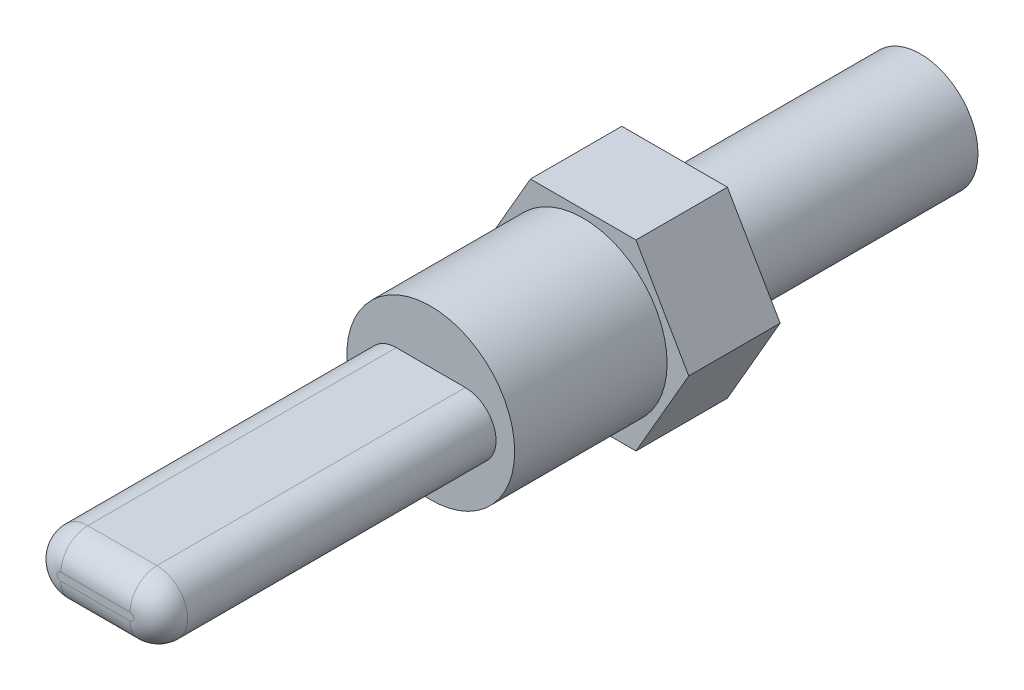
ISO-10303-21;
HEADER;
FILE_DESCRIPTION(('STEP AP214'),'2;1');
FILE_NAME('part.step','',(''),(''),'','','');
FILE_SCHEMA(('AUTOMOTIVE_DESIGN { 1 0 10303 214 1 1 1 1 }'));
ENDSEC;
DATA;
#1=APPLICATION_CONTEXT('core data for automotive mechanical design processes');
#2=APPLICATION_PROTOCOL_DEFINITION('international standard','automotive_design',2000,#1);
#3=PRODUCT_CONTEXT('',#1,'mechanical');
#4=PRODUCT('Part','Part','',(#3));
#5=PRODUCT_RELATED_PRODUCT_CATEGORY('part','',(#4));
#6=PRODUCT_DEFINITION_FORMATION('','',#4);
#7=PRODUCT_DEFINITION_CONTEXT('part definition',#1,'design');
#8=PRODUCT_DEFINITION('design','',#6,#7);
#9=PRODUCT_DEFINITION_SHAPE('','',#8);
#10=(LENGTH_UNIT() NAMED_UNIT(*) SI_UNIT(.MILLI.,.METRE.));
#11=(NAMED_UNIT(*) PLANE_ANGLE_UNIT() SI_UNIT($,.RADIAN.));
#12=(NAMED_UNIT(*) SI_UNIT($,.STERADIAN.) SOLID_ANGLE_UNIT());
#13=UNCERTAINTY_MEASURE_WITH_UNIT(LENGTH_MEASURE(1.E-05),#10,'distance_accuracy_value','');
#14=(GEOMETRIC_REPRESENTATION_CONTEXT(3) GLOBAL_UNCERTAINTY_ASSIGNED_CONTEXT((#13)) GLOBAL_UNIT_ASSIGNED_CONTEXT((#10,
#11,#12)) REPRESENTATION_CONTEXT('',''));
#15=CARTESIAN_POINT('',(0.,0.,0.));
#16=DIRECTION('',(0.,0.,1.));
#17=DIRECTION('',(1.,0.,0.));
#18=AXIS2_PLACEMENT_3D('',#15,#16,#17);
#19=CARTESIAN_POINT('',(0.,0.,12.75));
#20=DIRECTION('',(0.,0.,1.));
#21=DIRECTION('',(1.,0.,0.));
#22=AXIS2_PLACEMENT_3D('',#19,#20,#21);
#23=PLANE('',#22);
#24=CARTESIAN_POINT('',(0.,0.,12.75));
#25=DIRECTION('',(0.,0.,1.));
#26=DIRECTION('',(1.,0.,0.));
#27=AXIS2_PLACEMENT_3D('',#24,#25,#26);
#28=CIRCLE('',#27,2.185);
#29=CARTESIAN_POINT('',(2.185,0.,12.75));
#30=VERTEX_POINT('',#29);
#31=EDGE_CURVE('E152',#30,#30,#28,.T.);
#32=ORIENTED_EDGE('',*,*,#31,.T.);
#33=EDGE_LOOP('',(#32));
#34=FACE_BOUND('',#33,.T.);
#35=DIRECTION('',(1.,0.,0.));
#36=VECTOR('',#35,1.);
#37=CARTESIAN_POINT('',(-0.9,-0.8,12.75));
#38=LINE('',#37,#36);
#39=CARTESIAN_POINT('',(-0.9,-0.8,12.75));
#40=VERTEX_POINT('',#39);
#41=CARTESIAN_POINT('',(0.9,-0.8,12.75));
#42=VERTEX_POINT('',#41);
#43=EDGE_CURVE('E125',#40,#42,#38,.T.);
#44=ORIENTED_EDGE('',*,*,#43,.F.);
#45=CARTESIAN_POINT('',(-0.9,0.,12.75));
#46=DIRECTION('',(0.,0.,1.));
#47=DIRECTION('',(1.,0.,0.));
#48=AXIS2_PLACEMENT_3D('',#45,#46,#47);
#49=CIRCLE('',#48,0.8);
#50=CARTESIAN_POINT('',(-0.9,0.8,12.75));
#51=VERTEX_POINT('',#50);
#52=EDGE_CURVE('E133',#51,#40,#49,.T.);
#53=ORIENTED_EDGE('',*,*,#52,.F.);
#54=DIRECTION('',(-1.,0.,0.));
#55=VECTOR('',#54,1.);
#56=CARTESIAN_POINT('',(-0.9,0.8,12.75));
#57=LINE('',#56,#55);
#58=CARTESIAN_POINT('',(0.9,0.8,12.75));
#59=VERTEX_POINT('',#58);
#60=EDGE_CURVE('E144',#59,#51,#57,.T.);
#61=ORIENTED_EDGE('',*,*,#60,.F.);
#62=CARTESIAN_POINT('',(0.9,0.,12.75));
#63=DIRECTION('',(0.,0.,1.));
#64=DIRECTION('',(1.,0.,0.));
#65=AXIS2_PLACEMENT_3D('',#62,#63,#64);
#66=CIRCLE('',#65,0.8);
#67=EDGE_CURVE('E142',#42,#59,#66,.T.);
#68=ORIENTED_EDGE('',*,*,#67,.F.);
#69=EDGE_LOOP('',(#44,#53,#61,#68));
#70=FACE_BOUND('',#69,.T.);
#71=ADVANCED_FACE('F33',(#34,#70),#23,.T.);
#72=CARTESIAN_POINT('',(0.,0.,6.4));
#73=DIRECTION('',(0.,0.,-1.));
#74=DIRECTION('',(-1.,0.,0.));
#75=AXIS2_PLACEMENT_3D('',#72,#73,#74);
#76=CYLINDRICAL_SURFACE('',#75,1.5);
#77=CARTESIAN_POINT('',(0.,0.,6.4));
#78=DIRECTION('',(0.,0.,1.));
#79=DIRECTION('',(1.,0.,0.));
#80=AXIS2_PLACEMENT_3D('',#77,#78,#79);
#81=CIRCLE('',#80,1.5);
#82=CARTESIAN_POINT('',(1.5,0.,6.4));
#83=VERTEX_POINT('',#82);
#84=EDGE_CURVE('E202',#83,#83,#81,.T.);
#85=ORIENTED_EDGE('',*,*,#84,.F.);
#86=EDGE_LOOP('',(#85));
#87=FACE_BOUND('',#86,.T.);
#88=CARTESIAN_POINT('',(0.,0.,0.));
#89=DIRECTION('',(0.,0.,1.));
#90=DIRECTION('',(1.,0.,0.));
#91=AXIS2_PLACEMENT_3D('',#88,#89,#90);
#92=CIRCLE('',#91,1.5);
#93=CARTESIAN_POINT('',(1.5,0.,0.));
#94=VERTEX_POINT('',#93);
#95=EDGE_CURVE('E201',#94,#94,#92,.T.);
#96=ORIENTED_EDGE('',*,*,#95,.T.);
#97=EDGE_LOOP('',(#96));
#98=FACE_BOUND('',#97,.T.);
#99=ADVANCED_FACE('F256',(#87,#98),#76,.T.);
#100=CARTESIAN_POINT('',(0.,0.,0.));
#101=DIRECTION('',(0.,0.,1.));
#102=DIRECTION('',(1.,0.,0.));
#103=AXIS2_PLACEMENT_3D('',#100,#101,#102);
#104=PLANE('',#103);
#105=ORIENTED_EDGE('',*,*,#95,.F.);
#106=EDGE_LOOP('',(#105));
#107=FACE_BOUND('',#106,.T.);
#108=ADVANCED_FACE('F262',(#107),#104,.F.);
#109=CARTESIAN_POINT('',(-1.37409364067129,-2.38000000000001,8.78));
#110=DIRECTION('',(0.,1.,0.));
#111=DIRECTION('',(-1.,0.,0.));
#112=AXIS2_PLACEMENT_3D('',#109,#110,#111);
#113=PLANE('',#112);
#114=DIRECTION('',(1.,0.,0.));
#115=VECTOR('',#114,1.);
#116=CARTESIAN_POINT('',(-1.37409364067129,-2.38000000000001,6.4));
#117=LINE('',#116,#115);
#118=CARTESIAN_POINT('',(-1.37409364067129,-2.38000000000001,6.4));
#119=VERTEX_POINT('',#118);
#120=CARTESIAN_POINT('',(1.37409364067133,-2.37999999999999,6.4));
#121=VERTEX_POINT('',#120);
#122=EDGE_CURVE('E155',#119,#121,#117,.T.);
#123=ORIENTED_EDGE('',*,*,#122,.T.);
#124=DIRECTION('',(0.,0.,-1.));
#125=VECTOR('',#124,1.);
#126=CARTESIAN_POINT('',(1.37409364067133,-2.37999999999999,8.78));
#127=LINE('',#126,#125);
#128=CARTESIAN_POINT('',(1.37409364067133,-2.37999999999999,8.78));
#129=VERTEX_POINT('',#128);
#130=EDGE_CURVE('E198',#129,#121,#127,.T.);
#131=ORIENTED_EDGE('',*,*,#130,.F.);
#132=DIRECTION('',(1.,0.,0.));
#133=VECTOR('',#132,1.);
#134=CARTESIAN_POINT('',(-1.37409364067129,-2.38000000000001,8.78));
#135=LINE('',#134,#133);
#136=CARTESIAN_POINT('',(-1.37409364067129,-2.38000000000001,8.78));
#137=VERTEX_POINT('',#136);
#138=EDGE_CURVE('E158',#137,#129,#135,.T.);
#139=ORIENTED_EDGE('',*,*,#138,.F.);
#140=DIRECTION('',(0.,0.,-1.));
#141=VECTOR('',#140,1.);
#142=CARTESIAN_POINT('',(-1.37409364067129,-2.38000000000001,8.78));
#143=LINE('',#142,#141);
#144=EDGE_CURVE('E172',#137,#119,#143,.T.);
#145=ORIENTED_EDGE('',*,*,#144,.T.);
#146=EDGE_LOOP('',(#123,#131,#139,#145));
#147=FACE_BOUND('',#146,.T.);
#148=ADVANCED_FACE('F299',(#147),#113,.F.);
#149=CARTESIAN_POINT('',(1.37409364067133,-2.37999999999999,8.78));
#150=DIRECTION('',(-0.866025403784442,0.499999999999994,0.));
#151=DIRECTION('',(-0.499999999999994,-0.866025403784442,0.));
#152=AXIS2_PLACEMENT_3D('',#149,#150,#151);
#153=PLANE('',#152);
#154=DIRECTION('',(0.499999999999994,0.866025403784442,0.));
#155=VECTOR('',#154,1.);
#156=CARTESIAN_POINT('',(1.37409364067133,-2.37999999999999,6.4));
#157=LINE('',#156,#155);
#158=CARTESIAN_POINT('',(2.74818728134262,0.,6.4));
#159=VERTEX_POINT('',#158);
#160=EDGE_CURVE('E175',#121,#159,#157,.T.);
#161=ORIENTED_EDGE('',*,*,#160,.T.);
#162=DIRECTION('',(0.,0.,-1.));
#163=VECTOR('',#162,1.);
#164=CARTESIAN_POINT('',(2.74818728134262,0.,8.78));
#165=LINE('',#164,#163);
#166=CARTESIAN_POINT('',(2.74818728134262,0.,8.78));
#167=VERTEX_POINT('',#166);
#168=EDGE_CURVE('E195',#167,#159,#165,.T.);
#169=ORIENTED_EDGE('',*,*,#168,.F.);
#170=DIRECTION('',(0.499999999999994,0.866025403784442,0.));
#171=VECTOR('',#170,1.);
#172=CARTESIAN_POINT('',(1.37409364067133,-2.37999999999999,8.78));
#173=LINE('',#172,#171);
#174=EDGE_CURVE('E161',#129,#167,#173,.T.);
#175=ORIENTED_EDGE('',*,*,#174,.F.);
#176=ORIENTED_EDGE('',*,*,#130,.T.);
#177=EDGE_LOOP('',(#161,#169,#175,#176));
#178=FACE_BOUND('',#177,.T.);
#179=ADVANCED_FACE('F295',(#178),#153,.F.);
#180=CARTESIAN_POINT('',(2.74818728134262,0.,8.78));
#181=DIRECTION('',(-0.866025403784435,-0.500000000000006,0.));
#182=DIRECTION('',(0.500000000000006,-0.866025403784435,0.));
#183=AXIS2_PLACEMENT_3D('',#180,#181,#182);
#184=PLANE('',#183);
#185=DIRECTION('',(-0.500000000000006,0.866025403784435,0.));
#186=VECTOR('',#185,1.);
#187=CARTESIAN_POINT('',(2.74818728134262,0.,6.4));
#188=LINE('',#187,#186);
#189=CARTESIAN_POINT('',(1.37409364067129,2.38000000000001,6.4));
#190=VERTEX_POINT('',#189);
#191=EDGE_CURVE('E177',#159,#190,#188,.T.);
#192=ORIENTED_EDGE('',*,*,#191,.T.);
#193=DIRECTION('',(0.,0.,-1.));
#194=VECTOR('',#193,1.);
#195=CARTESIAN_POINT('',(1.37409364067129,2.38000000000001,8.78));
#196=LINE('',#195,#194);
#197=CARTESIAN_POINT('',(1.37409364067129,2.38000000000001,8.78));
#198=VERTEX_POINT('',#197);
#199=EDGE_CURVE('E192',#198,#190,#196,.T.);
#200=ORIENTED_EDGE('',*,*,#199,.F.);
#201=DIRECTION('',(-0.500000000000006,0.866025403784435,0.));
#202=VECTOR('',#201,1.);
#203=CARTESIAN_POINT('',(2.74818728134262,0.,8.78));
#204=LINE('',#203,#202);
#205=EDGE_CURVE('E164',#167,#198,#204,.T.);
#206=ORIENTED_EDGE('',*,*,#205,.F.);
#207=ORIENTED_EDGE('',*,*,#168,.T.);
#208=EDGE_LOOP('',(#192,#200,#206,#207));
#209=FACE_BOUND('',#208,.T.);
#210=ADVANCED_FACE('F291',(#209),#184,.F.);
#211=CARTESIAN_POINT('',(1.37409364067129,2.38000000000001,8.78));
#212=DIRECTION('',(0.,-1.,0.));
#213=DIRECTION('',(1.,0.,0.));
#214=AXIS2_PLACEMENT_3D('',#211,#212,#213);
#215=PLANE('',#214);
#216=DIRECTION('',(-1.,0.,0.));
#217=VECTOR('',#216,1.);
#218=CARTESIAN_POINT('',(1.37409364067129,2.38000000000001,6.4));
#219=LINE('',#218,#217);
#220=CARTESIAN_POINT('',(-1.37409364067133,2.37999999999999,6.4));
#221=VERTEX_POINT('',#220);
#222=EDGE_CURVE('E179',#190,#221,#219,.T.);
#223=ORIENTED_EDGE('',*,*,#222,.T.);
#224=DIRECTION('',(0.,0.,-1.));
#225=VECTOR('',#224,1.);
#226=CARTESIAN_POINT('',(-1.37409364067133,2.37999999999999,8.78));
#227=LINE('',#226,#225);
#228=CARTESIAN_POINT('',(-1.37409364067133,2.37999999999999,8.78));
#229=VERTEX_POINT('',#228);
#230=EDGE_CURVE('E189',#229,#221,#227,.T.);
#231=ORIENTED_EDGE('',*,*,#230,.F.);
#232=DIRECTION('',(-1.,0.,0.));
#233=VECTOR('',#232,1.);
#234=CARTESIAN_POINT('',(1.37409364067129,2.38000000000001,8.78));
#235=LINE('',#234,#233);
#236=EDGE_CURVE('E166',#198,#229,#235,.T.);
#237=ORIENTED_EDGE('',*,*,#236,.F.);
#238=ORIENTED_EDGE('',*,*,#199,.T.);
#239=EDGE_LOOP('',(#223,#231,#237,#238));
#240=FACE_BOUND('',#239,.T.);
#241=ADVANCED_FACE('F287',(#240),#215,.F.);
#242=CARTESIAN_POINT('',(-1.37409364067133,2.37999999999999,8.78));
#243=DIRECTION('',(0.866025403784442,-0.499999999999994,0.));
#244=DIRECTION('',(0.499999999999994,0.866025403784442,0.));
#245=AXIS2_PLACEMENT_3D('',#242,#243,#244);
#246=PLANE('',#245);
#247=DIRECTION('',(-0.499999999999994,-0.866025403784442,0.));
#248=VECTOR('',#247,1.);
#249=CARTESIAN_POINT('',(-1.37409364067133,2.37999999999999,6.4));
#250=LINE('',#249,#248);
#251=CARTESIAN_POINT('',(-2.74818728134262,0.,6.4));
#252=VERTEX_POINT('',#251);
#253=EDGE_CURVE('E181',#221,#252,#250,.T.);
#254=ORIENTED_EDGE('',*,*,#253,.T.);
#255=DIRECTION('',(0.,0.,-1.));
#256=VECTOR('',#255,1.);
#257=CARTESIAN_POINT('',(-2.74818728134262,0.,8.78));
#258=LINE('',#257,#256);
#259=CARTESIAN_POINT('',(-2.74818728134262,0.,8.78));
#260=VERTEX_POINT('',#259);
#261=EDGE_CURVE('E186',#260,#252,#258,.T.);
#262=ORIENTED_EDGE('',*,*,#261,.F.);
#263=DIRECTION('',(-0.499999999999994,-0.866025403784442,0.));
#264=VECTOR('',#263,1.);
#265=CARTESIAN_POINT('',(-1.37409364067133,2.37999999999999,8.78));
#266=LINE('',#265,#264);
#267=EDGE_CURVE('E168',#229,#260,#266,.T.);
#268=ORIENTED_EDGE('',*,*,#267,.F.);
#269=ORIENTED_EDGE('',*,*,#230,.T.);
#270=EDGE_LOOP('',(#254,#262,#268,#269));
#271=FACE_BOUND('',#270,.T.);
#272=ADVANCED_FACE('F283',(#271),#246,.F.);
#273=CARTESIAN_POINT('',(-2.74818728134262,0.,8.78));
#274=DIRECTION('',(0.866025403784435,0.500000000000006,0.));
#275=DIRECTION('',(-0.500000000000006,0.866025403784435,0.));
#276=AXIS2_PLACEMENT_3D('',#273,#274,#275);
#277=PLANE('',#276);
#278=DIRECTION('',(0.500000000000006,-0.866025403784435,0.));
#279=VECTOR('',#278,1.);
#280=CARTESIAN_POINT('',(-2.74818728134262,0.,6.4));
#281=LINE('',#280,#279);
#282=EDGE_CURVE('E162',#252,#119,#281,.T.);
#283=ORIENTED_EDGE('',*,*,#282,.T.);
#284=ORIENTED_EDGE('',*,*,#144,.F.);
#285=DIRECTION('',(0.500000000000006,-0.866025403784435,0.));
#286=VECTOR('',#285,1.);
#287=CARTESIAN_POINT('',(-2.74818728134262,0.,8.78));
#288=LINE('',#287,#286);
#289=EDGE_CURVE('E170',#260,#137,#288,.T.);
#290=ORIENTED_EDGE('',*,*,#289,.F.);
#291=ORIENTED_EDGE('',*,*,#261,.T.);
#292=EDGE_LOOP('',(#283,#284,#290,#291));
#293=FACE_BOUND('',#292,.T.);
#294=ADVANCED_FACE('F276',(#293),#277,.F.);
#295=CARTESIAN_POINT('',(0.,0.,8.78));
#296=DIRECTION('',(0.,0.,1.));
#297=DIRECTION('',(1.,0.,0.));
#298=AXIS2_PLACEMENT_3D('',#295,#296,#297);
#299=PLANE('',#298);
#300=CARTESIAN_POINT('',(0.,0.,8.78));
#301=DIRECTION('',(0.,0.,1.));
#302=DIRECTION('',(1.,0.,0.));
#303=AXIS2_PLACEMENT_3D('',#300,#301,#302);
#304=CIRCLE('',#303,2.185);
#305=CARTESIAN_POINT('',(2.185,0.,8.78));
#306=VERTEX_POINT('',#305);
#307=EDGE_CURVE('E129',#306,#306,#304,.T.);
#308=ORIENTED_EDGE('',*,*,#307,.F.);
#309=EDGE_LOOP('',(#308));
#310=FACE_BOUND('',#309,.T.);
#311=ORIENTED_EDGE('',*,*,#138,.T.);
#312=ORIENTED_EDGE('',*,*,#174,.T.);
#313=ORIENTED_EDGE('',*,*,#205,.T.);
#314=ORIENTED_EDGE('',*,*,#236,.T.);
#315=ORIENTED_EDGE('',*,*,#267,.T.);
#316=ORIENTED_EDGE('',*,*,#289,.T.);
#317=EDGE_LOOP('',(#311,#312,#313,#314,#315,#316));
#318=FACE_BOUND('',#317,.T.);
#319=ADVANCED_FACE('F273',(#310,#318),#299,.T.);
#320=CARTESIAN_POINT('',(0.,0.,6.4));
#321=DIRECTION('',(0.,0.,1.));
#322=DIRECTION('',(1.,0.,0.));
#323=AXIS2_PLACEMENT_3D('',#320,#321,#322);
#324=PLANE('',#323);
#325=ORIENTED_EDGE('',*,*,#84,.T.);
#326=EDGE_LOOP('',(#325));
#327=FACE_BOUND('',#326,.T.);
#328=ORIENTED_EDGE('',*,*,#122,.F.);
#329=ORIENTED_EDGE('',*,*,#282,.F.);
#330=ORIENTED_EDGE('',*,*,#253,.F.);
#331=ORIENTED_EDGE('',*,*,#222,.F.);
#332=ORIENTED_EDGE('',*,*,#191,.F.);
#333=ORIENTED_EDGE('',*,*,#160,.F.);
#334=EDGE_LOOP('',(#328,#329,#330,#331,#332,#333));
#335=FACE_BOUND('',#334,.T.);
#336=ADVANCED_FACE('F271',(#327,#335),#324,.F.);
#337=CARTESIAN_POINT('',(0.,0.,12.75));
#338=DIRECTION('',(0.,0.,-1.));
#339=DIRECTION('',(-1.,0.,0.));
#340=AXIS2_PLACEMENT_3D('',#337,#338,#339);
#341=CYLINDRICAL_SURFACE('',#340,2.185);
#342=ORIENTED_EDGE('',*,*,#31,.F.);
#343=EDGE_LOOP('',(#342));
#344=FACE_BOUND('',#343,.T.);
#345=ORIENTED_EDGE('',*,*,#307,.T.);
#346=EDGE_LOOP('',(#345));
#347=FACE_BOUND('',#346,.T.);
#348=ADVANCED_FACE('F268',(#344,#347),#341,.T.);
#349=CARTESIAN_POINT('',(-0.9,0.,21.48));
#350=DIRECTION('',(0.,0.,-1.));
#351=DIRECTION('',(-1.,0.,0.));
#352=AXIS2_PLACEMENT_3D('',#349,#350,#351);
#353=CYLINDRICAL_SURFACE('',#352,0.8);
#354=DIRECTION('',(0.,0.,-1.));
#355=VECTOR('',#354,1.);
#356=CARTESIAN_POINT('',(-0.9,-0.8,21.48));
#357=LINE('',#356,#355);
#358=CARTESIAN_POINT('',(-0.9,-0.8,20.78));
#359=VERTEX_POINT('',#358);
#360=EDGE_CURVE('E121',#359,#40,#357,.T.);
#361=ORIENTED_EDGE('',*,*,#360,.F.);
#362=CARTESIAN_POINT('',(-0.9,0.,20.78));
#363=DIRECTION('',(0.,0.,1.));
#364=DIRECTION('',(1.,0.,0.));
#365=AXIS2_PLACEMENT_3D('',#362,#363,#364);
#366=CIRCLE('',#365,0.8);
#367=CARTESIAN_POINT('',(-0.9,0.8,20.78));
#368=VERTEX_POINT('',#367);
#369=EDGE_CURVE('E11',#359,#368,#366,.F.);
#370=ORIENTED_EDGE('',*,*,#369,.T.);
#371=DIRECTION('',(0.,0.,-1.));
#372=VECTOR('',#371,1.);
#373=CARTESIAN_POINT('',(-0.9,0.8,21.48));
#374=LINE('',#373,#372);
#375=EDGE_CURVE('E136',#368,#51,#374,.T.);
#376=ORIENTED_EDGE('',*,*,#375,.T.);
#377=ORIENTED_EDGE('',*,*,#52,.T.);
#378=EDGE_LOOP('',(#361,#370,#376,#377));
#379=FACE_BOUND('',#378,.T.);
#380=ADVANCED_FACE('F134',(#379),#353,.T.);
#381=CARTESIAN_POINT('',(-0.9,-0.8,21.48));
#382=DIRECTION('',(0.,1.,0.));
#383=DIRECTION('',(0.,0.,1.));
#384=AXIS2_PLACEMENT_3D('',#381,#382,#383);
#385=PLANE('',#384);
#386=DIRECTION('',(0.,0.,-1.));
#387=VECTOR('',#386,1.);
#388=CARTESIAN_POINT('',(0.9,-0.8,21.48));
#389=LINE('',#388,#387);
#390=CARTESIAN_POINT('',(0.9,-0.8,20.78));
#391=VERTEX_POINT('',#390);
#392=EDGE_CURVE('E130',#391,#42,#389,.T.);
#393=ORIENTED_EDGE('',*,*,#392,.F.);
#394=DIRECTION('',(1.,0.,0.));
#395=VECTOR('',#394,1.);
#396=CARTESIAN_POINT('',(-0.9,-0.8,20.78));
#397=LINE('',#396,#395);
#398=EDGE_CURVE('E42',#391,#359,#397,.F.);
#399=ORIENTED_EDGE('',*,*,#398,.T.);
#400=ORIENTED_EDGE('',*,*,#360,.T.);
#401=ORIENTED_EDGE('',*,*,#43,.T.);
#402=EDGE_LOOP('',(#393,#399,#400,#401));
#403=FACE_BOUND('',#402,.T.);
#404=ADVANCED_FACE('F123',(#403),#385,.F.);
#405=CARTESIAN_POINT('',(0.9,0.,21.48));
#406=DIRECTION('',(0.,0.,-1.));
#407=DIRECTION('',(-1.,0.,0.));
#408=AXIS2_PLACEMENT_3D('',#405,#406,#407);
#409=CYLINDRICAL_SURFACE('',#408,0.8);
#410=DIRECTION('',(0.,0.,-1.));
#411=VECTOR('',#410,1.);
#412=CARTESIAN_POINT('',(0.9,0.8,21.48));
#413=LINE('',#412,#411);
#414=CARTESIAN_POINT('',(0.9,0.8,20.78));
#415=VERTEX_POINT('',#414);
#416=EDGE_CURVE('E149',#415,#59,#413,.T.);
#417=ORIENTED_EDGE('',*,*,#416,.F.);
#418=CARTESIAN_POINT('',(0.9,0.,20.78));
#419=DIRECTION('',(0.,0.,1.));
#420=DIRECTION('',(1.,0.,0.));
#421=AXIS2_PLACEMENT_3D('',#418,#419,#420);
#422=CIRCLE('',#421,0.8);
#423=EDGE_CURVE('E57',#415,#391,#422,.F.);
#424=ORIENTED_EDGE('',*,*,#423,.T.);
#425=ORIENTED_EDGE('',*,*,#392,.T.);
#426=ORIENTED_EDGE('',*,*,#67,.T.);
#427=EDGE_LOOP('',(#417,#424,#425,#426));
#428=FACE_BOUND('',#427,.T.);
#429=ADVANCED_FACE('F253',(#428),#409,.T.);
#430=CARTESIAN_POINT('',(-0.9,0.8,21.48));
#431=DIRECTION('',(0.,-1.,0.));
#432=DIRECTION('',(0.,0.,-1.));
#433=AXIS2_PLACEMENT_3D('',#430,#431,#432);
#434=PLANE('',#433);
#435=ORIENTED_EDGE('',*,*,#375,.F.);
#436=DIRECTION('',(-1.,0.,0.));
#437=VECTOR('',#436,1.);
#438=CARTESIAN_POINT('',(0.9,0.8,20.78));
#439=LINE('',#438,#437);
#440=EDGE_CURVE('E216',#368,#415,#439,.F.);
#441=ORIENTED_EDGE('',*,*,#440,.T.);
#442=ORIENTED_EDGE('',*,*,#416,.T.);
#443=ORIENTED_EDGE('',*,*,#60,.T.);
#444=EDGE_LOOP('',(#435,#441,#442,#443));
#445=FACE_BOUND('',#444,.T.);
#446=ADVANCED_FACE('F241',(#445),#434,.F.);
#447=CARTESIAN_POINT('',(-0.9,0.,21.48));
#448=DIRECTION('',(0.,0.,1.));
#449=DIRECTION('',(1.,0.,0.));
#450=AXIS2_PLACEMENT_3D('',#447,#448,#449);
#451=PLANE('',#450);
#452=CARTESIAN_POINT('',(0.9,0.,21.48));
#453=DIRECTION('',(0.,0.,1.));
#454=DIRECTION('',(1.,0.,0.));
#455=AXIS2_PLACEMENT_3D('',#452,#453,#454);
#456=CIRCLE('',#455,0.1);
#457=CARTESIAN_POINT('',(0.9,-0.1,21.48));
#458=VERTEX_POINT('',#457);
#459=CARTESIAN_POINT('',(0.9,0.1,21.48));
#460=VERTEX_POINT('',#459);
#461=EDGE_CURVE('E211',#458,#460,#456,.T.);
#462=ORIENTED_EDGE('',*,*,#461,.T.);
#463=DIRECTION('',(-1.,0.,0.));
#464=VECTOR('',#463,1.);
#465=CARTESIAN_POINT('',(-0.9,0.1,21.48));
#466=LINE('',#465,#464);
#467=CARTESIAN_POINT('',(-0.9,0.1,21.48));
#468=VERTEX_POINT('',#467);
#469=EDGE_CURVE('E213',#460,#468,#466,.T.);
#470=ORIENTED_EDGE('',*,*,#469,.T.);
#471=CARTESIAN_POINT('',(-0.9,0.,21.48));
#472=DIRECTION('',(0.,0.,1.));
#473=DIRECTION('',(1.,0.,0.));
#474=AXIS2_PLACEMENT_3D('',#471,#472,#473);
#475=CIRCLE('',#474,0.1);
#476=CARTESIAN_POINT('',(-0.9,-0.1,21.48));
#477=VERTEX_POINT('',#476);
#478=EDGE_CURVE('E205',#468,#477,#475,.T.);
#479=ORIENTED_EDGE('',*,*,#478,.T.);
#480=DIRECTION('',(1.,0.,0.));
#481=VECTOR('',#480,1.);
#482=CARTESIAN_POINT('',(0.9,-0.1,21.48));
#483=LINE('',#482,#481);
#484=EDGE_CURVE('E209',#477,#458,#483,.T.);
#485=ORIENTED_EDGE('',*,*,#484,.T.);
#486=EDGE_LOOP('',(#462,#470,#479,#485));
#487=FACE_BOUND('',#486,.T.);
#488=ADVANCED_FACE('F246',(#487),#451,.T.);
#489=CARTESIAN_POINT('',(-0.9,-0.1,20.78));
#490=DIRECTION('',(-1.,0.,0.));
#491=DIRECTION('',(0.,0.,1.));
#492=AXIS2_PLACEMENT_3D('',#489,#490,#491);
#493=CYLINDRICAL_SURFACE('',#492,0.7);
#494=CARTESIAN_POINT('',(-0.9,-0.1,20.78));
#495=DIRECTION('',(-1.,0.,0.));
#496=DIRECTION('',(0.,0.,1.));
#497=AXIS2_PLACEMENT_3D('',#494,#495,#496);
#498=CIRCLE('',#497,0.7);
#499=EDGE_CURVE('E224',#359,#477,#498,.T.);
#500=ORIENTED_EDGE('',*,*,#499,.F.);
#501=ORIENTED_EDGE('',*,*,#398,.F.);
#502=CARTESIAN_POINT('',(0.9,-0.1,20.78));
#503=DIRECTION('',(1.,0.,0.));
#504=DIRECTION('',(0.,1.,0.));
#505=AXIS2_PLACEMENT_3D('',#502,#503,#504);
#506=CIRCLE('',#505,0.7);
#507=EDGE_CURVE('E37',#458,#391,#506,.T.);
#508=ORIENTED_EDGE('',*,*,#507,.F.);
#509=ORIENTED_EDGE('',*,*,#484,.F.);
#510=EDGE_LOOP('',(#500,#501,#508,#509));
#511=FACE_BOUND('',#510,.T.);
#512=ADVANCED_FACE('F35',(#511),#493,.T.);
#513=CARTESIAN_POINT('',(0.9,0.,20.78));
#514=DIRECTION('',(0.,0.,1.));
#515=DIRECTION('',(1.,0.,0.));
#516=AXIS2_PLACEMENT_3D('',#513,#514,#515);
#517=DEGENERATE_TOROIDAL_SURFACE('',#516,0.1,0.7,.T.);
#518=ORIENTED_EDGE('',*,*,#507,.T.);
#519=ORIENTED_EDGE('',*,*,#423,.F.);
#520=CARTESIAN_POINT('',(0.9,0.1,20.78));
#521=DIRECTION('',(-1.,0.,0.));
#522=DIRECTION('',(0.,0.,1.));
#523=AXIS2_PLACEMENT_3D('',#520,#521,#522);
#524=CIRCLE('',#523,0.7);
#525=EDGE_CURVE('E223',#460,#415,#524,.T.);
#526=ORIENTED_EDGE('',*,*,#525,.F.);
#527=ORIENTED_EDGE('',*,*,#461,.F.);
#528=EDGE_LOOP('',(#518,#519,#526,#527));
#529=FACE_BOUND('',#528,.T.);
#530=ADVANCED_FACE('F233',(#529),#517,.T.);
#531=CARTESIAN_POINT('',(-0.9,0.,20.78));
#532=DIRECTION('',(0.,0.,1.));
#533=DIRECTION('',(1.,0.,0.));
#534=AXIS2_PLACEMENT_3D('',#531,#532,#533);
#535=DEGENERATE_TOROIDAL_SURFACE('',#534,0.1,0.7,.T.);
#536=ORIENTED_EDGE('',*,*,#499,.T.);
#537=ORIENTED_EDGE('',*,*,#478,.F.);
#538=CARTESIAN_POINT('',(-0.9,0.1,20.78));
#539=DIRECTION('',(1.,0.,0.));
#540=DIRECTION('',(0.,0.,-1.));
#541=AXIS2_PLACEMENT_3D('',#538,#539,#540);
#542=CIRCLE('',#541,0.7);
#543=EDGE_CURVE('E221',#368,#468,#542,.T.);
#544=ORIENTED_EDGE('',*,*,#543,.F.);
#545=ORIENTED_EDGE('',*,*,#369,.F.);
#546=EDGE_LOOP('',(#536,#537,#544,#545));
#547=FACE_BOUND('',#546,.T.);
#548=ADVANCED_FACE('F238',(#547),#535,.T.);
#549=CARTESIAN_POINT('',(-0.9,0.1,20.78));
#550=DIRECTION('',(1.,0.,0.));
#551=DIRECTION('',(0.,0.,-1.));
#552=AXIS2_PLACEMENT_3D('',#549,#550,#551);
#553=CYLINDRICAL_SURFACE('',#552,0.7);
#554=ORIENTED_EDGE('',*,*,#525,.T.);
#555=ORIENTED_EDGE('',*,*,#440,.F.);
#556=ORIENTED_EDGE('',*,*,#543,.T.);
#557=ORIENTED_EDGE('',*,*,#469,.F.);
#558=EDGE_LOOP('',(#554,#555,#556,#557));
#559=FACE_BOUND('',#558,.T.);
#560=ADVANCED_FACE('F243',(#559),#553,.T.);
#561=CLOSED_SHELL('',(#71,#99,#108,#148,#179,#210,#241,#272,#294,#319,#336,#348,#380,#404,#429,
#446,#488,#512,#530,#548,#560));
#562=MANIFOLD_SOLID_BREP('B2',#561);
#563=ADVANCED_BREP_SHAPE_REPRESENTATION('',(#18,#562),#14);
#564=SHAPE_DEFINITION_REPRESENTATION(#9,#563);
ENDSEC;
END-ISO-10303-21;
